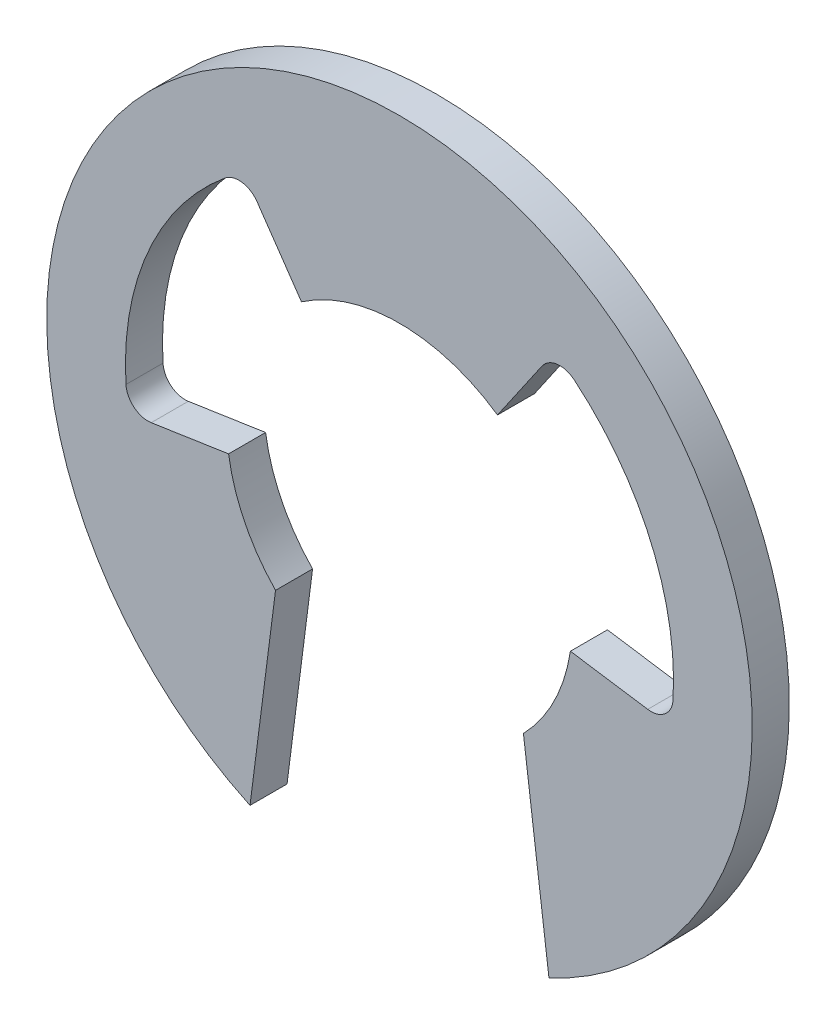
ISO-10303-21;
HEADER;
FILE_DESCRIPTION(('STEP AP214'),'2;1');
FILE_NAME('part.step','',(''),(''),'','','');
FILE_SCHEMA(('AUTOMOTIVE_DESIGN { 1 0 10303 214 1 1 1 1 }'));
ENDSEC;
DATA;
#1=APPLICATION_CONTEXT('core data for automotive mechanical design processes');
#2=APPLICATION_PROTOCOL_DEFINITION('international standard','automotive_design',2000,#1);
#3=PRODUCT_CONTEXT('',#1,'mechanical');
#4=PRODUCT('Part','Part','',(#3));
#5=PRODUCT_RELATED_PRODUCT_CATEGORY('part','',(#4));
#6=PRODUCT_DEFINITION_FORMATION('','',#4);
#7=PRODUCT_DEFINITION_CONTEXT('part definition',#1,'design');
#8=PRODUCT_DEFINITION('design','',#6,#7);
#9=PRODUCT_DEFINITION_SHAPE('','',#8);
#10=(LENGTH_UNIT() NAMED_UNIT(*) SI_UNIT(.MILLI.,.METRE.));
#11=(NAMED_UNIT(*) PLANE_ANGLE_UNIT() SI_UNIT($,.RADIAN.));
#12=(NAMED_UNIT(*) SI_UNIT($,.STERADIAN.) SOLID_ANGLE_UNIT());
#13=UNCERTAINTY_MEASURE_WITH_UNIT(LENGTH_MEASURE(1.E-05),#10,'distance_accuracy_value','');
#14=(GEOMETRIC_REPRESENTATION_CONTEXT(3) GLOBAL_UNCERTAINTY_ASSIGNED_CONTEXT((#13)) GLOBAL_UNIT_ASSIGNED_CONTEXT((#10,
#11,#12)) REPRESENTATION_CONTEXT('',''));
#15=CARTESIAN_POINT('',(0.,0.,0.));
#16=DIRECTION('',(0.,0.,1.));
#17=DIRECTION('',(1.,0.,0.));
#18=AXIS2_PLACEMENT_3D('',#15,#16,#17);
#19=CARTESIAN_POINT('',(0.,0.,1.06679999999998));
#20=DIRECTION('',(0.,0.,1.));
#21=DIRECTION('',(0.,-1.,0.));
#22=AXIS2_PLACEMENT_3D('',#19,#20,#21);
#23=PLANE('',#22);
#24=CARTESIAN_POINT('',(0.,0.,1.0667999999999));
#25=DIRECTION('',(0.,0.,-1.));
#26=DIRECTION('',(0.,1.,0.));
#27=AXIS2_PLACEMENT_3D('',#24,#25,#26);
#28=CIRCLE('',#27,4.9784);
#29=CARTESIAN_POINT('',(4.92271487326642,-0.742525983735144,1.06679999999994));
#30=VERTEX_POINT('',#29);
#31=CARTESIAN_POINT('',(3.56992690011167,-3.46988306544466,1.06679999999994));
#32=VERTEX_POINT('',#31);
#33=EDGE_CURVE('E205',#30,#32,#28,.T.);
#34=ORIENTED_EDGE('',*,*,#33,.T.);
#35=DIRECTION('',(-0.127237776683912,0.991872243882515,0.));
#36=VECTOR('',#35,1.);
#37=CARTESIAN_POINT('',(3.56992690011169,-3.46988306544478,1.06679999999998));
#38=LINE('',#37,#36);
#39=CARTESIAN_POINT('',(4.30533502010196,-9.20270016705335,1.06679999999998));
#40=VERTEX_POINT('',#39);
#41=EDGE_CURVE('E156',#32,#40,#38,.F.);
#42=ORIENTED_EDGE('',*,*,#41,.T.);
#43=CARTESIAN_POINT('',(0.,0.,1.06679999999998));
#44=DIRECTION('',(0.,0.,-1.));
#45=DIRECTION('',(0.,1.,0.));
#46=AXIS2_PLACEMENT_3D('',#43,#44,#45);
#47=CIRCLE('',#46,10.16);
#48=CARTESIAN_POINT('',(-4.30533502010185,-9.20270016705334,1.06679999999998));
#49=VERTEX_POINT('',#48);
#50=EDGE_CURVE('E159',#49,#40,#47,.T.);
#51=ORIENTED_EDGE('',*,*,#50,.F.);
#52=DIRECTION('',(-0.127237776683911,-0.991872243882515,0.));
#53=VECTOR('',#52,1.);
#54=CARTESIAN_POINT('',(-3.56992690011157,-3.46988306544477,1.06679999999998));
#55=LINE('',#54,#53);
#56=CARTESIAN_POINT('',(-3.56992690011153,-3.46988306544472,1.06680000000031));
#57=VERTEX_POINT('',#56);
#58=EDGE_CURVE('E131',#49,#57,#55,.F.);
#59=ORIENTED_EDGE('',*,*,#58,.T.);
#60=CARTESIAN_POINT('',(0.,0.,1.06680000000065));
#61=DIRECTION('',(0.,0.,-1.));
#62=DIRECTION('',(0.,1.,0.));
#63=AXIS2_PLACEMENT_3D('',#60,#61,#62);
#64=CIRCLE('',#63,4.9784);
#65=CARTESIAN_POINT('',(-4.92271487326619,-0.742525983735149,1.06680000000028));
#66=VERTEX_POINT('',#65);
#67=EDGE_CURVE('E19',#57,#66,#64,.T.);
#68=ORIENTED_EDGE('',*,*,#67,.T.);
#69=DIRECTION('',(0.988814653958378,0.149149522685036,0.));
#70=VECTOR('',#69,1.);
#71=CARTESIAN_POINT('',(-4.92271487326613,-0.742525983735139,1.06679999999992));
#72=LINE('',#71,#70);
#73=CARTESIAN_POINT('',(-7.14991563056865,-1.07846955874755,1.06679999999998));
#74=VERTEX_POINT('',#73);
#75=EDGE_CURVE('E127',#66,#74,#72,.F.);
#76=ORIENTED_EDGE('',*,*,#75,.T.);
#77=CARTESIAN_POINT('',(-7.24462557747352,-0.45057225348399,1.06680000000003));
#78=DIRECTION('',(0.,0.,-1.));
#79=DIRECTION('',(0.,1.,0.));
#80=AXIS2_PLACEMENT_3D('',#77,#78,#79);
#81=CIRCLE('',#80,0.635000000000001);
#82=CARTESIAN_POINT('',(-7.87840100910403,-0.489989283581507,1.06680000000033));
#83=VERTEX_POINT('',#82);
#84=EDGE_CURVE('E222',#74,#83,#81,.T.);
#85=ORIENTED_EDGE('',*,*,#84,.T.);
#86=CARTESIAN_POINT('',(0.,0.,1.06679999999998));
#87=DIRECTION('',(0.,0.,-1.));
#88=DIRECTION('',(0.,1.,0.));
#89=AXIS2_PLACEMENT_3D('',#86,#87,#88);
#90=CIRCLE('',#89,7.89362349990665);
#91=CARTESIAN_POINT('',(-5.0280487652255,6.08506512477831,1.06679999999999));
#92=VERTEX_POINT('',#91);
#93=EDGE_CURVE('E220',#83,#92,#90,.T.);
#94=ORIENTED_EDGE('',*,*,#93,.T.);
#95=CARTESIAN_POINT('',(-4.62356900178676,5.59555402074849,1.06680000000001));
#96=DIRECTION('',(0.,0.,-1.));
#97=DIRECTION('',(0.,1.,0.));
#98=AXIS2_PLACEMENT_3D('',#95,#96,#97);
#99=CIRCLE('',#98,0.635000000000001);
#100=CARTESIAN_POINT('',(-4.10054988076431,5.95565955950804,1.06679999999997));
#101=VERTEX_POINT('',#100);
#102=EDGE_CURVE('E217',#92,#101,#99,.T.);
#103=ORIENTED_EDGE('',*,*,#102,.T.);
#104=DIRECTION('',(-0.567095336629127,0.823652159089926,0.));
#105=VECTOR('',#104,1.);
#106=CARTESIAN_POINT('',(-2.82322742387417,4.10046990881329,1.06679999999992));
#107=LINE('',#106,#105);
#108=CARTESIAN_POINT('',(-2.82322742387423,4.10046990881344,1.06679999999998));
#109=VERTEX_POINT('',#108);
#110=EDGE_CURVE('E169',#101,#109,#107,.F.);
#111=ORIENTED_EDGE('',*,*,#110,.T.);
#112=CARTESIAN_POINT('',(0.,0.,1.06679999999998));
#113=DIRECTION('',(0.,0.,-1.));
#114=DIRECTION('',(0.,1.,0.));
#115=AXIS2_PLACEMENT_3D('',#112,#113,#114);
#116=CIRCLE('',#115,4.9784);
#117=CARTESIAN_POINT('',(2.8232274238747,4.10046990881312,1.0668000000001));
#118=VERTEX_POINT('',#117);
#119=EDGE_CURVE('E215',#109,#118,#116,.T.);
#120=ORIENTED_EDGE('',*,*,#119,.T.);
#121=DIRECTION('',(-0.567095336629127,-0.823652159089927,0.));
#122=VECTOR('',#121,1.);
#123=CARTESIAN_POINT('',(2.82322742387481,4.10046990881328,1.06680000000023));
#124=LINE('',#123,#122);
#125=CARTESIAN_POINT('',(4.1005498807649,5.95565955950796,1.06680000000016));
#126=VERTEX_POINT('',#125);
#127=EDGE_CURVE('E165',#118,#126,#124,.F.);
#128=ORIENTED_EDGE('',*,*,#127,.T.);
#129=CARTESIAN_POINT('',(4.62356900178701,5.59555402074848,1.06680000000009));
#130=DIRECTION('',(0.,0.,-1.));
#131=DIRECTION('',(0.,1.,0.));
#132=AXIS2_PLACEMENT_3D('',#129,#130,#131);
#133=CIRCLE('',#132,0.635000000000001);
#134=CARTESIAN_POINT('',(5.02804876522567,6.08506512477829,1.06680000000004));
#135=VERTEX_POINT('',#134);
#136=EDGE_CURVE('E213',#126,#135,#133,.T.);
#137=ORIENTED_EDGE('',*,*,#136,.T.);
#138=CARTESIAN_POINT('',(0.,0.,1.06679999999998));
#139=DIRECTION('',(0.,0.,-1.));
#140=DIRECTION('',(0.,1.,0.));
#141=AXIS2_PLACEMENT_3D('',#138,#139,#140);
#142=CIRCLE('',#141,7.89362349990665);
#143=CARTESIAN_POINT('',(7.87840100910413,-0.489989283581498,1.06679999999998));
#144=VERTEX_POINT('',#143);
#145=EDGE_CURVE('E210',#135,#144,#142,.T.);
#146=ORIENTED_EDGE('',*,*,#145,.T.);
#147=CARTESIAN_POINT('',(7.24462557747366,-0.450572253483992,1.06679999999998));
#148=DIRECTION('',(0.,0.,-1.));
#149=DIRECTION('',(0.,1.,0.));
#150=AXIS2_PLACEMENT_3D('',#147,#148,#149);
#151=CIRCLE('',#150,0.635000000000001);
#152=CARTESIAN_POINT('',(7.14991563056874,-1.07846955874751,1.06679999999998));
#153=VERTEX_POINT('',#152);
#154=EDGE_CURVE('E207',#144,#153,#151,.T.);
#155=ORIENTED_EDGE('',*,*,#154,.T.);
#156=DIRECTION('',(0.988814653958378,-0.149149522685037,0.));
#157=VECTOR('',#156,1.);
#158=CARTESIAN_POINT('',(4.92271487326648,-0.742525983735152,1.06679999999998));
#159=LINE('',#158,#157);
#160=EDGE_CURVE('E161',#153,#30,#159,.F.);
#161=ORIENTED_EDGE('',*,*,#160,.T.);
#162=EDGE_LOOP('',(#34,#42,#51,#59,#68,#76,#85,#94,#103,#111,#120,#128,#137,#146,#155,#161));
#163=FACE_BOUND('',#162,.T.);
#164=ADVANCED_FACE('F16',(#163),#23,.T.);
#165=CARTESIAN_POINT('',(-3.56992690011157,-3.46988306544477,1.06680000000065));
#166=DIRECTION('',(-0.991872243882515,0.127237776683911,0.));
#167=DIRECTION('',(-0.127237776683911,-0.991872243882515,0.));
#168=AXIS2_PLACEMENT_3D('',#165,#166,#167);
#169=PLANE('',#168);
#170=DIRECTION('',(0.,0.,-1.));
#171=VECTOR('',#170,1.);
#172=CARTESIAN_POINT('',(-3.56992690011144,-3.46988306544478,1.06679999999998));
#173=LINE('',#172,#171);
#174=CARTESIAN_POINT('',(-3.56992690011144,-3.46988306544478,0.));
#175=VERTEX_POINT('',#174);
#176=EDGE_CURVE('E136',#175,#57,#173,.F.);
#177=ORIENTED_EDGE('',*,*,#176,.T.);
#178=ORIENTED_EDGE('',*,*,#58,.F.);
#179=DIRECTION('',(0.,0.,1.));
#180=VECTOR('',#179,1.);
#181=CARTESIAN_POINT('',(-4.30533502010184,-9.20270016705331,1.06680000000065));
#182=LINE('',#181,#180);
#183=CARTESIAN_POINT('',(-4.30533502010161,-9.20270016705345,0.));
#184=VERTEX_POINT('',#183);
#185=EDGE_CURVE('E153',#184,#49,#182,.T.);
#186=ORIENTED_EDGE('',*,*,#185,.F.);
#187=DIRECTION('',(0.127237776683851,0.991872243882523,0.));
#188=VECTOR('',#187,1.);
#189=CARTESIAN_POINT('',(-4.30533502010136,-9.20270016705337,0.));
#190=LINE('',#189,#188);
#191=EDGE_CURVE('E201',#184,#175,#190,.T.);
#192=ORIENTED_EDGE('',*,*,#191,.T.);
#193=EDGE_LOOP('',(#177,#178,#186,#192));
#194=FACE_BOUND('',#193,.T.);
#195=ADVANCED_FACE('F402',(#194),#169,.F.);
#196=CARTESIAN_POINT('',(0.,0.,1.06679999999998));
#197=DIRECTION('',(0.,0.,-1.));
#198=DIRECTION('',(0.,1.,0.));
#199=AXIS2_PLACEMENT_3D('',#196,#197,#198);
#200=CYLINDRICAL_SURFACE('',#199,4.9784);
#201=DIRECTION('',(0.,0.,1.));
#202=VECTOR('',#201,1.);
#203=CARTESIAN_POINT('',(-4.92271487326602,-0.742525983735123,1.06679999999992));
#204=LINE('',#203,#202);
#205=CARTESIAN_POINT('',(-4.92271487326619,-0.742525983735176,0.));
#206=VERTEX_POINT('',#205);
#207=EDGE_CURVE('E135',#206,#66,#204,.T.);
#208=ORIENTED_EDGE('',*,*,#207,.T.);
#209=ORIENTED_EDGE('',*,*,#67,.F.);
#210=ORIENTED_EDGE('',*,*,#176,.F.);
#211=CARTESIAN_POINT('',(0.,0.,0.));
#212=DIRECTION('',(0.,0.,-1.));
#213=DIRECTION('',(0.,1.,0.));
#214=AXIS2_PLACEMENT_3D('',#211,#212,#213);
#215=CIRCLE('',#214,4.9784);
#216=EDGE_CURVE('E147',#175,#206,#215,.T.);
#217=ORIENTED_EDGE('',*,*,#216,.T.);
#218=EDGE_LOOP('',(#208,#209,#210,#217));
#219=FACE_BOUND('',#218,.T.);
#220=ADVANCED_FACE('F145',(#219),#200,.F.);
#221=CARTESIAN_POINT('',(-4.92271487326613,-0.742525983735139,1.06679999999992));
#222=DIRECTION('',(0.149149522685036,-0.988814653958378,0.));
#223=DIRECTION('',(0.988814653958378,0.149149522685036,0.));
#224=AXIS2_PLACEMENT_3D('',#221,#222,#223);
#225=PLANE('',#224);
#226=DIRECTION('',(0.,0.,-1.));
#227=VECTOR('',#226,1.);
#228=CARTESIAN_POINT('',(-7.14991563056876,-1.0784695587476,1.06679999999976));
#229=LINE('',#228,#227);
#230=CARTESIAN_POINT('',(-7.14991563056866,-1.07846955874752,3.61019989054748E-13));
#231=VERTEX_POINT('',#230);
#232=EDGE_CURVE('E142',#231,#74,#229,.F.);
#233=ORIENTED_EDGE('',*,*,#232,.T.);
#234=ORIENTED_EDGE('',*,*,#75,.F.);
#235=ORIENTED_EDGE('',*,*,#207,.F.);
#236=DIRECTION('',(-0.988814653958383,-0.149149522684997,0.));
#237=VECTOR('',#236,1.);
#238=CARTESIAN_POINT('',(-4.92271487326601,-0.742525983735178,0.));
#239=LINE('',#238,#237);
#240=EDGE_CURVE('E199',#206,#231,#239,.T.);
#241=ORIENTED_EDGE('',*,*,#240,.T.);
#242=EDGE_LOOP('',(#233,#234,#235,#241));
#243=FACE_BOUND('',#242,.T.);
#244=ADVANCED_FACE('F139',(#243),#225,.F.);
#245=CARTESIAN_POINT('',(-7.24462557747352,-0.45057225348399,1.06679999999976));
#246=DIRECTION('',(0.,0.,-1.));
#247=DIRECTION('',(0.,1.,0.));
#248=AXIS2_PLACEMENT_3D('',#245,#246,#247);
#249=CYLINDRICAL_SURFACE('',#248,0.635000000000001);
#250=DIRECTION('',(0.,0.,-1.));
#251=VECTOR('',#250,1.);
#252=CARTESIAN_POINT('',(-7.87840100910415,-0.489989283581509,1.06679999999998));
#253=LINE('',#252,#251);
#254=CARTESIAN_POINT('',(-7.87840100910415,-0.489989283581515,3.92279589873819E-13));
#255=VERTEX_POINT('',#254);
#256=EDGE_CURVE('E221',#255,#83,#253,.F.);
#257=ORIENTED_EDGE('',*,*,#256,.T.);
#258=ORIENTED_EDGE('',*,*,#84,.F.);
#259=ORIENTED_EDGE('',*,*,#232,.F.);
#260=CARTESIAN_POINT('',(-7.24462557747352,-0.45057225348399,7.21644966006352E-13));
#261=DIRECTION('',(0.,0.,-1.));
#262=DIRECTION('',(0.,1.,0.));
#263=AXIS2_PLACEMENT_3D('',#260,#261,#262);
#264=CIRCLE('',#263,0.635000000000001);
#265=EDGE_CURVE('E196',#231,#255,#264,.T.);
#266=ORIENTED_EDGE('',*,*,#265,.T.);
#267=EDGE_LOOP('',(#257,#258,#259,#266));
#268=FACE_BOUND('',#267,.T.);
#269=ADVANCED_FACE('F294',(#268),#249,.F.);
#270=CARTESIAN_POINT('',(0.,0.,1.06679999999998));
#271=DIRECTION('',(0.,0.,-1.));
#272=DIRECTION('',(0.,1.,0.));
#273=AXIS2_PLACEMENT_3D('',#270,#271,#272);
#274=CYLINDRICAL_SURFACE('',#273,7.89362349990665);
#275=ORIENTED_EDGE('',*,*,#93,.F.);
#276=ORIENTED_EDGE('',*,*,#256,.F.);
#277=CARTESIAN_POINT('',(0.,0.,0.));
#278=DIRECTION('',(0.,0.,-1.));
#279=DIRECTION('',(0.,1.,0.));
#280=AXIS2_PLACEMENT_3D('',#277,#278,#279);
#281=CIRCLE('',#280,7.89362349990665);
#282=CARTESIAN_POINT('',(-5.02804876522553,6.08506512477834,0.));
#283=VERTEX_POINT('',#282);
#284=EDGE_CURVE('E194',#255,#283,#281,.T.);
#285=ORIENTED_EDGE('',*,*,#284,.T.);
#286=DIRECTION('',(0.,0.,-1.));
#287=VECTOR('',#286,1.);
#288=CARTESIAN_POINT('',(-5.02804876522535,6.08506512477849,1.06679999999998));
#289=LINE('',#288,#287);
#290=EDGE_CURVE('E219',#283,#92,#289,.F.);
#291=ORIENTED_EDGE('',*,*,#290,.T.);
#292=EDGE_LOOP('',(#275,#276,#285,#291));
#293=FACE_BOUND('',#292,.T.);
#294=ADVANCED_FACE('F292',(#293),#274,.F.);
#295=CARTESIAN_POINT('',(-4.62356900178676,5.59555402074849,1.06679999999998));
#296=DIRECTION('',(0.,0.,-1.));
#297=DIRECTION('',(0.,1.,0.));
#298=AXIS2_PLACEMENT_3D('',#295,#296,#297);
#299=CYLINDRICAL_SURFACE('',#298,0.635000000000001);
#300=DIRECTION('',(0.,0.,1.));
#301=VECTOR('',#300,1.);
#302=CARTESIAN_POINT('',(-4.10054988076422,5.95565955950791,1.06679999999998));
#303=LINE('',#302,#301);
#304=CARTESIAN_POINT('',(-4.10054988076427,5.95565955950806,0.));
#305=VERTEX_POINT('',#304);
#306=EDGE_CURVE('E171',#305,#101,#303,.T.);
#307=ORIENTED_EDGE('',*,*,#306,.T.);
#308=ORIENTED_EDGE('',*,*,#102,.F.);
#309=ORIENTED_EDGE('',*,*,#290,.F.);
#310=CARTESIAN_POINT('',(-4.62356900178676,5.59555402074849,0.));
#311=DIRECTION('',(0.,0.,-1.));
#312=DIRECTION('',(0.,1.,0.));
#313=AXIS2_PLACEMENT_3D('',#310,#311,#312);
#314=CIRCLE('',#313,0.635000000000001);
#315=EDGE_CURVE('E191',#283,#305,#314,.T.);
#316=ORIENTED_EDGE('',*,*,#315,.T.);
#317=EDGE_LOOP('',(#307,#308,#309,#316));
#318=FACE_BOUND('',#317,.T.);
#319=ADVANCED_FACE('F289',(#318),#299,.F.);
#320=CARTESIAN_POINT('',(-2.82322742387417,4.10046990881329,1.06679999999998));
#321=DIRECTION('',(0.823652159089926,0.567095336629127,0.));
#322=DIRECTION('',(-0.567095336629127,0.823652159089926,0.));
#323=AXIS2_PLACEMENT_3D('',#320,#321,#322);
#324=PLANE('',#323);
#325=DIRECTION('',(0.,0.,-1.));
#326=VECTOR('',#325,1.);
#327=CARTESIAN_POINT('',(-2.8232274238742,4.10046990881346,1.06679999999998));
#328=LINE('',#327,#326);
#329=CARTESIAN_POINT('',(-2.82322742387419,4.10046990881346,1.24820090153454E-13));
#330=VERTEX_POINT('',#329);
#331=EDGE_CURVE('E170',#330,#109,#328,.F.);
#332=ORIENTED_EDGE('',*,*,#331,.T.);
#333=ORIENTED_EDGE('',*,*,#110,.F.);
#334=ORIENTED_EDGE('',*,*,#306,.F.);
#335=DIRECTION('',(0.56709533662912,-0.823652159089931,0.));
#336=VECTOR('',#335,1.);
#337=CARTESIAN_POINT('',(-4.10054988076414,5.95565955950797,0.));
#338=LINE('',#337,#336);
#339=EDGE_CURVE('E190',#305,#330,#338,.T.);
#340=ORIENTED_EDGE('',*,*,#339,.T.);
#341=EDGE_LOOP('',(#332,#333,#334,#340));
#342=FACE_BOUND('',#341,.T.);
#343=ADVANCED_FACE('F284',(#342),#324,.F.);
#344=CARTESIAN_POINT('',(0.,0.,1.06679999999998));
#345=DIRECTION('',(0.,0.,-1.));
#346=DIRECTION('',(0.,1.,0.));
#347=AXIS2_PLACEMENT_3D('',#344,#345,#346);
#348=CYLINDRICAL_SURFACE('',#347,4.9784);
#349=DIRECTION('',(0.,0.,1.));
#350=VECTOR('',#349,1.);
#351=CARTESIAN_POINT('',(2.82322742387468,4.10046990881309,1.06680000000023));
#352=LINE('',#351,#350);
#353=CARTESIAN_POINT('',(2.82322742387457,4.10046990881321,2.49653558610112E-13));
#354=VERTEX_POINT('',#353);
#355=EDGE_CURVE('E168',#354,#118,#352,.T.);
#356=ORIENTED_EDGE('',*,*,#355,.T.);
#357=ORIENTED_EDGE('',*,*,#119,.F.);
#358=ORIENTED_EDGE('',*,*,#331,.F.);
#359=CARTESIAN_POINT('',(0.,0.,2.4980018054066E-13));
#360=DIRECTION('',(0.,0.,-1.));
#361=DIRECTION('',(0.,1.,0.));
#362=AXIS2_PLACEMENT_3D('',#359,#360,#361);
#363=CIRCLE('',#362,4.9784);
#364=EDGE_CURVE('E187',#330,#354,#363,.T.);
#365=ORIENTED_EDGE('',*,*,#364,.T.);
#366=EDGE_LOOP('',(#356,#357,#358,#365));
#367=FACE_BOUND('',#366,.T.);
#368=ADVANCED_FACE('F280',(#367),#348,.F.);
#369=CARTESIAN_POINT('',(2.82322742387481,4.10046990881328,1.06680000000023));
#370=DIRECTION('',(-0.823652159089927,0.567095336629127,0.));
#371=DIRECTION('',(-0.567095336629127,-0.823652159089927,0.));
#372=AXIS2_PLACEMENT_3D('',#369,#370,#371);
#373=PLANE('',#372);
#374=DIRECTION('',(0.,0.,-1.));
#375=VECTOR('',#374,1.);
#376=CARTESIAN_POINT('',(4.10054988076489,5.95565955950796,1.06679999999998));
#377=LINE('',#376,#375);
#378=CARTESIAN_POINT('',(4.10054988076494,5.955659559508,0.));
#379=VERTEX_POINT('',#378);
#380=EDGE_CURVE('E167',#379,#126,#377,.F.);
#381=ORIENTED_EDGE('',*,*,#380,.T.);
#382=ORIENTED_EDGE('',*,*,#127,.F.);
#383=ORIENTED_EDGE('',*,*,#355,.F.);
#384=DIRECTION('',(0.567095336629252,0.82365215908984,0.));
#385=VECTOR('',#384,1.);
#386=CARTESIAN_POINT('',(2.82322742387442,4.10046990881328,0.));
#387=LINE('',#386,#385);
#388=EDGE_CURVE('E186',#354,#379,#387,.T.);
#389=ORIENTED_EDGE('',*,*,#388,.T.);
#390=EDGE_LOOP('',(#381,#382,#383,#389));
#391=FACE_BOUND('',#390,.T.);
#392=ADVANCED_FACE('F276',(#391),#373,.F.);
#393=CARTESIAN_POINT('',(4.62356900178701,5.59555402074848,1.06679999999998));
#394=DIRECTION('',(0.,0.,-1.));
#395=DIRECTION('',(0.,1.,0.));
#396=AXIS2_PLACEMENT_3D('',#393,#394,#395);
#397=CYLINDRICAL_SURFACE('',#396,0.635000000000001);
#398=DIRECTION('',(0.,0.,-1.));
#399=VECTOR('',#398,1.);
#400=CARTESIAN_POINT('',(5.02804876522538,6.08506512477841,1.06679999999998));
#401=LINE('',#400,#399);
#402=CARTESIAN_POINT('',(5.02804876522561,6.08506512477822,0.));
#403=VERTEX_POINT('',#402);
#404=EDGE_CURVE('E212',#403,#135,#401,.F.);
#405=ORIENTED_EDGE('',*,*,#404,.T.);
#406=ORIENTED_EDGE('',*,*,#136,.F.);
#407=ORIENTED_EDGE('',*,*,#380,.F.);
#408=CARTESIAN_POINT('',(4.62356900178701,5.59555402074848,0.));
#409=DIRECTION('',(0.,0.,-1.));
#410=DIRECTION('',(0.,1.,0.));
#411=AXIS2_PLACEMENT_3D('',#408,#409,#410);
#412=CIRCLE('',#411,0.635000000000001);
#413=EDGE_CURVE('E183',#379,#403,#412,.T.);
#414=ORIENTED_EDGE('',*,*,#413,.T.);
#415=EDGE_LOOP('',(#405,#406,#407,#414));
#416=FACE_BOUND('',#415,.T.);
#417=ADVANCED_FACE('F272',(#416),#397,.F.);
#418=CARTESIAN_POINT('',(0.,0.,1.06679999999998));
#419=DIRECTION('',(0.,0.,-1.));
#420=DIRECTION('',(0.,1.,0.));
#421=AXIS2_PLACEMENT_3D('',#418,#419,#420);
#422=CYLINDRICAL_SURFACE('',#421,7.89362349990665);
#423=DIRECTION('',(0.,0.,-1.));
#424=VECTOR('',#423,1.);
#425=CARTESIAN_POINT('',(7.87840100910406,-0.489989283581479,1.06680000000015));
#426=LINE('',#425,#424);
#427=CARTESIAN_POINT('',(7.87840100910406,-0.489989283581493,0.));
#428=VERTEX_POINT('',#427);
#429=EDGE_CURVE('E209',#428,#144,#426,.F.);
#430=ORIENTED_EDGE('',*,*,#429,.T.);
#431=ORIENTED_EDGE('',*,*,#145,.F.);
#432=ORIENTED_EDGE('',*,*,#404,.F.);
#433=CARTESIAN_POINT('',(0.,0.,0.));
#434=DIRECTION('',(0.,0.,-1.));
#435=DIRECTION('',(0.,1.,0.));
#436=AXIS2_PLACEMENT_3D('',#433,#434,#435);
#437=CIRCLE('',#436,7.89362349990665);
#438=EDGE_CURVE('E180',#403,#428,#437,.T.);
#439=ORIENTED_EDGE('',*,*,#438,.T.);
#440=EDGE_LOOP('',(#430,#431,#432,#439));
#441=FACE_BOUND('',#440,.T.);
#442=ADVANCED_FACE('F268',(#441),#422,.F.);
#443=CARTESIAN_POINT('',(7.24462557747366,-0.450572253483992,1.06680000000015));
#444=DIRECTION('',(0.,0.,-1.));
#445=DIRECTION('',(0.,1.,0.));
#446=AXIS2_PLACEMENT_3D('',#443,#444,#445);
#447=CYLINDRICAL_SURFACE('',#446,0.635000000000001);
#448=DIRECTION('',(0.,0.,1.));
#449=VECTOR('',#448,1.);
#450=CARTESIAN_POINT('',(7.14991563056881,-1.07846955874752,1.0667999999999));
#451=LINE('',#450,#449);
#452=CARTESIAN_POINT('',(7.14991563056874,-1.07846955874752,0.));
#453=VERTEX_POINT('',#452);
#454=EDGE_CURVE('E164',#453,#153,#451,.T.);
#455=ORIENTED_EDGE('',*,*,#454,.T.);
#456=ORIENTED_EDGE('',*,*,#154,.F.);
#457=ORIENTED_EDGE('',*,*,#429,.F.);
#458=CARTESIAN_POINT('',(7.24462557747366,-0.450572253483992,0.));
#459=DIRECTION('',(0.,0.,-1.));
#460=DIRECTION('',(0.,1.,0.));
#461=AXIS2_PLACEMENT_3D('',#458,#459,#460);
#462=CIRCLE('',#461,0.635000000000001);
#463=EDGE_CURVE('E177',#428,#453,#462,.T.);
#464=ORIENTED_EDGE('',*,*,#463,.T.);
#465=EDGE_LOOP('',(#455,#456,#457,#464));
#466=FACE_BOUND('',#465,.T.);
#467=ADVANCED_FACE('F264',(#466),#447,.F.);
#468=CARTESIAN_POINT('',(4.92271487326648,-0.742525983735152,1.0667999999999));
#469=DIRECTION('',(-0.149149522685037,-0.988814653958378,0.));
#470=DIRECTION('',(0.988814653958378,-0.149149522685037,0.));
#471=AXIS2_PLACEMENT_3D('',#468,#469,#470);
#472=PLANE('',#471);
#473=DIRECTION('',(0.,0.,-1.));
#474=VECTOR('',#473,1.);
#475=CARTESIAN_POINT('',(4.92271487326642,-0.742525983735148,1.06679999999998));
#476=LINE('',#475,#474);
#477=CARTESIAN_POINT('',(4.92271487326642,-0.742525983735148,0.));
#478=VERTEX_POINT('',#477);
#479=EDGE_CURVE('E163',#478,#30,#476,.F.);
#480=ORIENTED_EDGE('',*,*,#479,.T.);
#481=ORIENTED_EDGE('',*,*,#160,.F.);
#482=ORIENTED_EDGE('',*,*,#454,.F.);
#483=DIRECTION('',(-0.988814653958376,0.149149522685045,0.));
#484=VECTOR('',#483,1.);
#485=CARTESIAN_POINT('',(7.1499156305688,-1.07846955874754,0.));
#486=LINE('',#485,#484);
#487=EDGE_CURVE('E176',#453,#478,#486,.T.);
#488=ORIENTED_EDGE('',*,*,#487,.T.);
#489=EDGE_LOOP('',(#480,#481,#482,#488));
#490=FACE_BOUND('',#489,.T.);
#491=ADVANCED_FACE('F257',(#490),#472,.F.);
#492=CARTESIAN_POINT('',(0.,0.,1.06679999999998));
#493=DIRECTION('',(0.,0.,-1.));
#494=DIRECTION('',(0.,1.,0.));
#495=AXIS2_PLACEMENT_3D('',#492,#493,#494);
#496=CYLINDRICAL_SURFACE('',#495,4.9784);
#497=DIRECTION('',(0.,0.,1.));
#498=VECTOR('',#497,1.);
#499=CARTESIAN_POINT('',(3.56992690011168,-3.46988306544472,1.06679999999998));
#500=LINE('',#499,#498);
#501=CARTESIAN_POINT('',(3.5699269001115,-3.46988306544484,0.));
#502=VERTEX_POINT('',#501);
#503=EDGE_CURVE('E160',#502,#32,#500,.T.);
#504=ORIENTED_EDGE('',*,*,#503,.T.);
#505=ORIENTED_EDGE('',*,*,#33,.F.);
#506=ORIENTED_EDGE('',*,*,#479,.F.);
#507=CARTESIAN_POINT('',(0.,0.,0.));
#508=DIRECTION('',(0.,0.,-1.));
#509=DIRECTION('',(0.,1.,0.));
#510=AXIS2_PLACEMENT_3D('',#507,#508,#509);
#511=CIRCLE('',#510,4.9784);
#512=EDGE_CURVE('E25',#478,#502,#511,.T.);
#513=ORIENTED_EDGE('',*,*,#512,.T.);
#514=EDGE_LOOP('',(#504,#505,#506,#513));
#515=FACE_BOUND('',#514,.T.);
#516=ADVANCED_FACE('F316',(#515),#496,.F.);
#517=CARTESIAN_POINT('',(3.56992690011169,-3.46988306544478,1.06679999999998));
#518=DIRECTION('',(0.991872243882515,0.127237776683912,0.));
#519=DIRECTION('',(-0.127237776683912,0.991872243882515,0.));
#520=AXIS2_PLACEMENT_3D('',#517,#518,#519);
#521=PLANE('',#520);
#522=DIRECTION('',(0.,0.,-1.));
#523=VECTOR('',#522,1.);
#524=CARTESIAN_POINT('',(4.30533502010196,-9.20270016705335,1.06679999999998));
#525=LINE('',#524,#523);
#526=CARTESIAN_POINT('',(4.30533502010178,-9.20270016705343,0.));
#527=VERTEX_POINT('',#526);
#528=EDGE_CURVE('E203',#40,#527,#525,.T.);
#529=ORIENTED_EDGE('',*,*,#528,.F.);
#530=ORIENTED_EDGE('',*,*,#41,.F.);
#531=ORIENTED_EDGE('',*,*,#503,.F.);
#532=DIRECTION('',(0.127237776683913,-0.991872243882515,0.));
#533=VECTOR('',#532,1.);
#534=CARTESIAN_POINT('',(3.56992690011129,-3.46988306544477,0.));
#535=LINE('',#534,#533);
#536=EDGE_CURVE('E11',#502,#527,#535,.T.);
#537=ORIENTED_EDGE('',*,*,#536,.T.);
#538=EDGE_LOOP('',(#529,#530,#531,#537));
#539=FACE_BOUND('',#538,.T.);
#540=ADVANCED_FACE('F310',(#539),#521,.F.);
#541=CARTESIAN_POINT('',(0.,0.,1.06679999999998));
#542=DIRECTION('',(0.,0.,-1.));
#543=DIRECTION('',(0.,1.,0.));
#544=AXIS2_PLACEMENT_3D('',#541,#542,#543);
#545=CYLINDRICAL_SURFACE('',#544,10.16);
#546=ORIENTED_EDGE('',*,*,#528,.T.);
#547=CARTESIAN_POINT('',(0.,0.,0.));
#548=DIRECTION('',(0.,0.,-1.));
#549=DIRECTION('',(0.,1.,0.));
#550=AXIS2_PLACEMENT_3D('',#547,#548,#549);
#551=CIRCLE('',#550,10.16);
#552=EDGE_CURVE('E34',#527,#184,#551,.F.);
#553=ORIENTED_EDGE('',*,*,#552,.T.);
#554=ORIENTED_EDGE('',*,*,#185,.T.);
#555=ORIENTED_EDGE('',*,*,#50,.T.);
#556=EDGE_LOOP('',(#546,#553,#554,#555));
#557=FACE_BOUND('',#556,.T.);
#558=ADVANCED_FACE('F305',(#557),#545,.T.);
#559=CARTESIAN_POINT('',(0.,0.,0.));
#560=DIRECTION('',(0.,0.,1.));
#561=DIRECTION('',(0.,-1.,0.));
#562=AXIS2_PLACEMENT_3D('',#559,#560,#561);
#563=PLANE('',#562);
#564=ORIENTED_EDGE('',*,*,#536,.F.);
#565=ORIENTED_EDGE('',*,*,#512,.F.);
#566=ORIENTED_EDGE('',*,*,#487,.F.);
#567=ORIENTED_EDGE('',*,*,#463,.F.);
#568=ORIENTED_EDGE('',*,*,#438,.F.);
#569=ORIENTED_EDGE('',*,*,#413,.F.);
#570=ORIENTED_EDGE('',*,*,#388,.F.);
#571=ORIENTED_EDGE('',*,*,#364,.F.);
#572=ORIENTED_EDGE('',*,*,#339,.F.);
#573=ORIENTED_EDGE('',*,*,#315,.F.);
#574=ORIENTED_EDGE('',*,*,#284,.F.);
#575=ORIENTED_EDGE('',*,*,#265,.F.);
#576=ORIENTED_EDGE('',*,*,#240,.F.);
#577=ORIENTED_EDGE('',*,*,#216,.F.);
#578=ORIENTED_EDGE('',*,*,#191,.F.);
#579=ORIENTED_EDGE('',*,*,#552,.F.);
#580=EDGE_LOOP('',(#564,#565,#566,#567,#568,#569,#570,#571,#572,#573,#574,#575,#576,#577,#578,#579));
#581=FACE_BOUND('',#580,.T.);
#582=ADVANCED_FACE('F261',(#581),#563,.F.);
#583=CLOSED_SHELL('',(#164,#195,#220,#244,#269,#294,#319,#343,#368,#392,#417,#442,#467,#491,
#516,#540,#558,#582));
#584=MANIFOLD_SOLID_BREP('B1',#583);
#585=ADVANCED_BREP_SHAPE_REPRESENTATION('',(#18,#584),#14);
#586=SHAPE_DEFINITION_REPRESENTATION(#9,#585);
ENDSEC;
END-ISO-10303-21;
